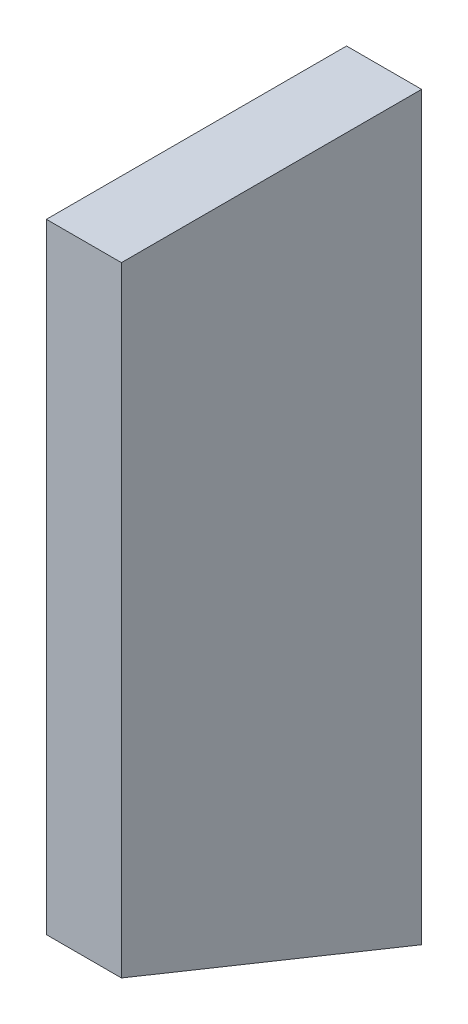
ISO-10303-21;
HEADER;
FILE_DESCRIPTION(('STEP AP214'),'2;1');
FILE_NAME('part.step','',(''),(''),'','','');
FILE_SCHEMA(('AUTOMOTIVE_DESIGN { 1 0 10303 214 1 1 1 1 }'));
ENDSEC;
DATA;
#1=APPLICATION_CONTEXT('core data for automotive mechanical design processes');
#2=APPLICATION_PROTOCOL_DEFINITION('international standard','automotive_design',2000,#1);
#3=PRODUCT_CONTEXT('',#1,'mechanical');
#4=PRODUCT('Part','Part','',(#3));
#5=PRODUCT_RELATED_PRODUCT_CATEGORY('part','',(#4));
#6=PRODUCT_DEFINITION_FORMATION('','',#4);
#7=PRODUCT_DEFINITION_CONTEXT('part definition',#1,'design');
#8=PRODUCT_DEFINITION('design','',#6,#7);
#9=PRODUCT_DEFINITION_SHAPE('','',#8);
#10=(LENGTH_UNIT() NAMED_UNIT(*) SI_UNIT(.MILLI.,.METRE.));
#11=(NAMED_UNIT(*) PLANE_ANGLE_UNIT() SI_UNIT($,.RADIAN.));
#12=(NAMED_UNIT(*) SI_UNIT($,.STERADIAN.) SOLID_ANGLE_UNIT());
#13=UNCERTAINTY_MEASURE_WITH_UNIT(LENGTH_MEASURE(1.E-05),#10,'distance_accuracy_value','');
#14=(GEOMETRIC_REPRESENTATION_CONTEXT(3) GLOBAL_UNCERTAINTY_ASSIGNED_CONTEXT((#13)) GLOBAL_UNIT_ASSIGNED_CONTEXT((#10,
#11,#12)) REPRESENTATION_CONTEXT('',''));
#15=CARTESIAN_POINT('',(0.,0.,0.));
#16=DIRECTION('',(0.,0.,1.));
#17=DIRECTION('',(1.,0.,0.));
#18=AXIS2_PLACEMENT_3D('',#15,#16,#17);
#19=CARTESIAN_POINT('',(455.995949006174,6983.72999013993,11.7613809128093));
#20=DIRECTION('',(0.,0.,-1.));
#21=DIRECTION('',(-1.,0.,0.));
#22=AXIS2_PLACEMENT_3D('',#19,#20,#21);
#23=PLANE('',#22);
#24=DIRECTION('',(-1.20010897863981E-13,1.,0.));
#25=VECTOR('',#24,1.);
#26=CARTESIAN_POINT('',(475.045949006174,6983.72999013993,11.7613809128093));
#27=LINE('',#26,#25);
#28=CARTESIAN_POINT('',(475.045949006193,6826.46267729957,11.7613809128093));
#29=VERTEX_POINT('',#28);
#30=CARTESIAN_POINT('',(475.045949006174,6983.72999013993,11.7613809128093));
#31=VERTEX_POINT('',#30);
#32=EDGE_CURVE('E96',#29,#31,#27,.T.);
#33=ORIENTED_EDGE('',*,*,#32,.T.);
#34=DIRECTION('',(1.,1.19839932551034E-13,0.));
#35=VECTOR('',#34,1.);
#36=CARTESIAN_POINT('',(455.995949006174,6983.72999013993,11.7613809128093));
#37=LINE('',#36,#35);
#38=CARTESIAN_POINT('',(455.995949006174,6983.72999013993,11.7613809128093));
#39=VERTEX_POINT('',#38);
#40=EDGE_CURVE('E11',#39,#31,#37,.T.);
#41=ORIENTED_EDGE('',*,*,#40,.F.);
#42=DIRECTION('',(-1.20010897863981E-13,1.,0.));
#43=VECTOR('',#42,1.);
#44=CARTESIAN_POINT('',(455.995949006174,6983.72999013993,11.7613809128093));
#45=LINE('',#44,#43);
#46=CARTESIAN_POINT('',(455.995949006193,6826.46267729956,11.7613809128093));
#47=VERTEX_POINT('',#46);
#48=EDGE_CURVE('E84',#47,#39,#45,.T.);
#49=ORIENTED_EDGE('',*,*,#48,.F.);
#50=DIRECTION('',(1.,1.19839932551034E-13,0.));
#51=VECTOR('',#50,1.);
#52=CARTESIAN_POINT('',(455.995949006193,6826.46267729956,11.7613809128093));
#53=LINE('',#52,#51);
#54=EDGE_CURVE('E92',#47,#29,#53,.T.);
#55=ORIENTED_EDGE('',*,*,#54,.T.);
#56=EDGE_LOOP('',(#33,#41,#49,#55));
#57=FACE_BOUND('',#56,.T.);
#58=ADVANCED_FACE('F33',(#57),#23,.F.);
#59=CARTESIAN_POINT('',(455.995949006174,6983.72999013993,11.7613809128093));
#60=DIRECTION('',(1.19839932551034E-13,-1.,0.));
#61=DIRECTION('',(1.,1.19839932551034E-13,0.));
#62=AXIS2_PLACEMENT_3D('',#59,#60,#61);
#63=PLANE('',#62);
#64=DIRECTION('',(0.,0.,-1.));
#65=VECTOR('',#64,1.);
#66=CARTESIAN_POINT('',(475.045949006174,6983.72999013993,11.7613809128093));
#67=LINE('',#66,#65);
#68=CARTESIAN_POINT('',(475.045949006174,6983.72999013993,-64.4386190871907));
#69=VERTEX_POINT('',#68);
#70=EDGE_CURVE('E88',#31,#69,#67,.T.);
#71=ORIENTED_EDGE('',*,*,#70,.T.);
#72=DIRECTION('',(1.,1.19839932551034E-13,0.));
#73=VECTOR('',#72,1.);
#74=CARTESIAN_POINT('',(455.995949006174,6983.72999013993,-64.4386190871907));
#75=LINE('',#74,#73);
#76=CARTESIAN_POINT('',(455.995949006174,6983.72999013993,-64.4386190871907));
#77=VERTEX_POINT('',#76);
#78=EDGE_CURVE('E41',#77,#69,#75,.T.);
#79=ORIENTED_EDGE('',*,*,#78,.F.);
#80=DIRECTION('',(0.,0.,-1.));
#81=VECTOR('',#80,1.);
#82=CARTESIAN_POINT('',(455.995949006174,6983.72999013993,11.7613809128093));
#83=LINE('',#82,#81);
#84=EDGE_CURVE('E79',#39,#77,#83,.T.);
#85=ORIENTED_EDGE('',*,*,#84,.F.);
#86=ORIENTED_EDGE('',*,*,#40,.T.);
#87=EDGE_LOOP('',(#71,#79,#85,#86));
#88=FACE_BOUND('',#87,.T.);
#89=ADVANCED_FACE('F87',(#88),#63,.F.);
#90=CARTESIAN_POINT('',(455.995949006174,6983.72999013993,-64.4386190871907));
#91=DIRECTION('',(0.,0.,1.));
#92=DIRECTION('',(1.,0.,0.));
#93=AXIS2_PLACEMENT_3D('',#90,#91,#92);
#94=PLANE('',#93);
#95=DIRECTION('',(1.19845970131694E-13,-1.,0.));
#96=VECTOR('',#95,1.);
#97=CARTESIAN_POINT('',(475.045949006174,6983.72999013993,-64.4386190871907));
#98=LINE('',#97,#96);
#99=CARTESIAN_POINT('',(475.045949006196,6795.67587889092,-64.4386190871907));
#100=VERTEX_POINT('',#99);
#101=EDGE_CURVE('E66',#69,#100,#98,.T.);
#102=ORIENTED_EDGE('',*,*,#101,.T.);
#103=DIRECTION('',(1.,1.19839932551034E-13,0.));
#104=VECTOR('',#103,1.);
#105=CARTESIAN_POINT('',(455.995949006196,6795.67587889092,-64.4386190871907));
#106=LINE('',#105,#104);
#107=CARTESIAN_POINT('',(455.995949006196,6795.67587889092,-64.4386190871907));
#108=VERTEX_POINT('',#107);
#109=EDGE_CURVE('E89',#108,#100,#106,.T.);
#110=ORIENTED_EDGE('',*,*,#109,.F.);
#111=DIRECTION('',(1.19845970131694E-13,-1.,0.));
#112=VECTOR('',#111,1.);
#113=CARTESIAN_POINT('',(455.995949006174,6983.72999013993,-64.4386190871907));
#114=LINE('',#113,#112);
#115=EDGE_CURVE('E82',#77,#108,#114,.T.);
#116=ORIENTED_EDGE('',*,*,#115,.F.);
#117=ORIENTED_EDGE('',*,*,#78,.T.);
#118=EDGE_LOOP('',(#102,#110,#116,#117));
#119=FACE_BOUND('',#118,.T.);
#120=ADVANCED_FACE('F90',(#119),#94,.F.);
#121=CARTESIAN_POINT('',(455.995949006193,6826.46267729956,11.7613809128093));
#122=DIRECTION('',(-1.11049859623022E-13,0.927183854566769,-0.374606593415956));
#123=DIRECTION('',(0.,0.374606593415956,0.92718385456677));
#124=AXIS2_PLACEMENT_3D('',#121,#122,#123);
#125=PLANE('',#124);
#126=DIRECTION('',(0.,0.374606593415956,0.92718385456677));
#127=VECTOR('',#126,1.);
#128=CARTESIAN_POINT('',(475.045949006193,6826.46267729957,11.7613809128093));
#129=LINE('',#128,#127);
#130=EDGE_CURVE('E72',#100,#29,#129,.T.);
#131=ORIENTED_EDGE('',*,*,#130,.T.);
#132=ORIENTED_EDGE('',*,*,#54,.F.);
#133=DIRECTION('',(0.,0.374606593415956,0.92718385456677));
#134=VECTOR('',#133,1.);
#135=CARTESIAN_POINT('',(455.995949006193,6826.46267729956,11.7613809128093));
#136=LINE('',#135,#134);
#137=EDGE_CURVE('E49',#108,#47,#136,.T.);
#138=ORIENTED_EDGE('',*,*,#137,.F.);
#139=ORIENTED_EDGE('',*,*,#109,.T.);
#140=EDGE_LOOP('',(#131,#132,#138,#139));
#141=FACE_BOUND('',#140,.T.);
#142=ADVANCED_FACE('F103',(#141),#125,.F.);
#143=CARTESIAN_POINT('',(455.995949007012,5.47277401518814E-11,0.));
#144=DIRECTION('',(1.,1.20010897863981E-13,0.));
#145=DIRECTION('',(-1.20010897863981E-13,1.,0.));
#146=AXIS2_PLACEMENT_3D('',#143,#144,#145);
#147=PLANE('',#146);
#148=ORIENTED_EDGE('',*,*,#48,.T.);
#149=ORIENTED_EDGE('',*,*,#84,.T.);
#150=ORIENTED_EDGE('',*,*,#115,.T.);
#151=ORIENTED_EDGE('',*,*,#137,.T.);
#152=EDGE_LOOP('',(#148,#149,#150,#151));
#153=FACE_BOUND('',#152,.T.);
#154=ADVANCED_FACE('F80',(#153),#147,.F.);
#155=CARTESIAN_POINT('',(475.045949007012,5.70106908669786E-11,0.));
#156=DIRECTION('',(1.,1.20010897863981E-13,0.));
#157=DIRECTION('',(-1.20010897863981E-13,1.,0.));
#158=AXIS2_PLACEMENT_3D('',#155,#156,#157);
#159=PLANE('',#158);
#160=ORIENTED_EDGE('',*,*,#32,.F.);
#161=ORIENTED_EDGE('',*,*,#130,.F.);
#162=ORIENTED_EDGE('',*,*,#101,.F.);
#163=ORIENTED_EDGE('',*,*,#70,.F.);
#164=EDGE_LOOP('',(#160,#161,#162,#163));
#165=FACE_BOUND('',#164,.T.);
#166=ADVANCED_FACE('F106',(#165),#159,.T.);
#167=CLOSED_SHELL('',(#58,#89,#120,#142,#154,#166));
#168=MANIFOLD_SOLID_BREP('B2',#167);
#169=ADVANCED_BREP_SHAPE_REPRESENTATION('',(#18,#168),#14);
#170=SHAPE_DEFINITION_REPRESENTATION(#9,#169);
ENDSEC;
END-ISO-10303-21;
